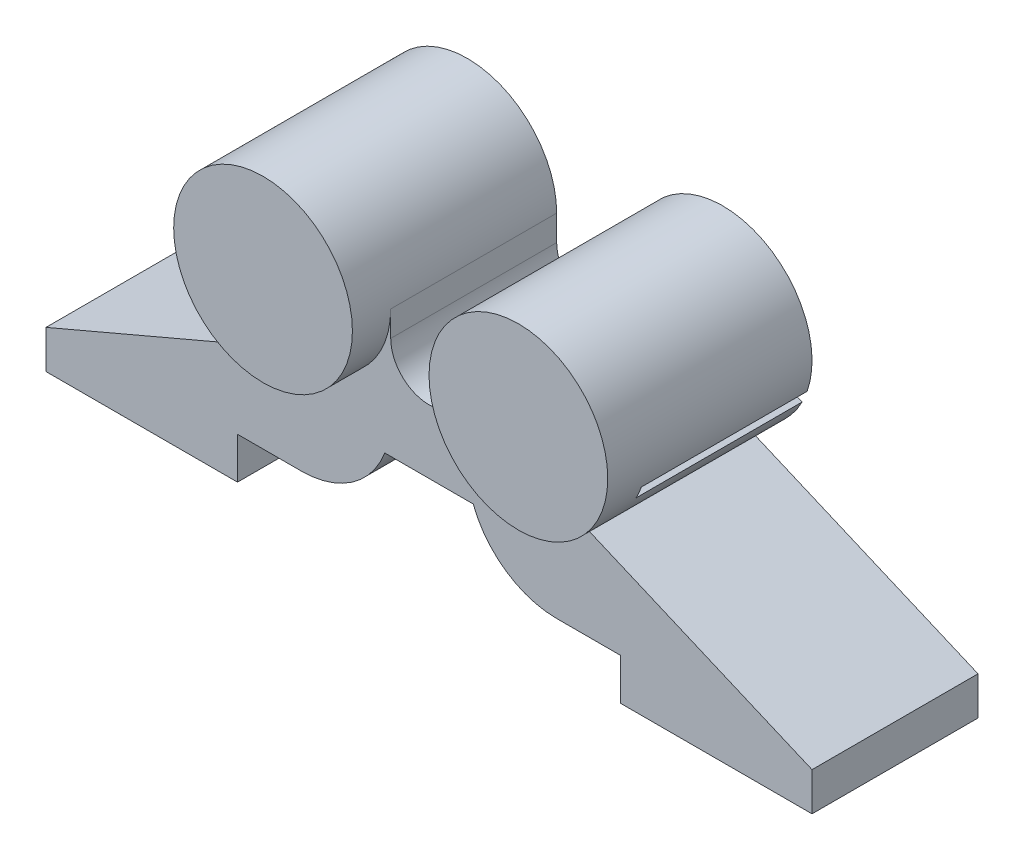
ISO-10303-21;
HEADER;
FILE_DESCRIPTION(('STEP AP214'),'2;1');
FILE_NAME('part.step','',(''),(''),'','','');
FILE_SCHEMA(('AUTOMOTIVE_DESIGN { 1 0 10303 214 1 1 1 1 }'));
ENDSEC;
DATA;
#1=APPLICATION_CONTEXT('core data for automotive mechanical design processes');
#2=APPLICATION_PROTOCOL_DEFINITION('international standard','automotive_design',2000,#1);
#3=PRODUCT_CONTEXT('',#1,'mechanical');
#4=PRODUCT('Part','Part','',(#3));
#5=PRODUCT_RELATED_PRODUCT_CATEGORY('part','',(#4));
#6=PRODUCT_DEFINITION_FORMATION('','',#4);
#7=PRODUCT_DEFINITION_CONTEXT('part definition',#1,'design');
#8=PRODUCT_DEFINITION('design','',#6,#7);
#9=PRODUCT_DEFINITION_SHAPE('','',#8);
#10=(LENGTH_UNIT() NAMED_UNIT(*) SI_UNIT(.MILLI.,.METRE.));
#11=(NAMED_UNIT(*) PLANE_ANGLE_UNIT() SI_UNIT($,.RADIAN.));
#12=(NAMED_UNIT(*) SI_UNIT($,.STERADIAN.) SOLID_ANGLE_UNIT());
#13=UNCERTAINTY_MEASURE_WITH_UNIT(LENGTH_MEASURE(1.E-05),#10,'distance_accuracy_value','');
#14=(GEOMETRIC_REPRESENTATION_CONTEXT(3) GLOBAL_UNCERTAINTY_ASSIGNED_CONTEXT((#13)) GLOBAL_UNIT_ASSIGNED_CONTEXT((#10,
#11,#12)) REPRESENTATION_CONTEXT('',''));
#15=CARTESIAN_POINT('',(0.,0.,0.));
#16=DIRECTION('',(0.,0.,1.));
#17=DIRECTION('',(1.,0.,0.));
#18=AXIS2_PLACEMENT_3D('',#15,#16,#17);
#19=CARTESIAN_POINT('',(10.,0.,13.));
#20=DIRECTION('',(0.,0.,-1.));
#21=DIRECTION('',(-1.,0.,0.));
#22=AXIS2_PLACEMENT_3D('',#19,#20,#21);
#23=CYLINDRICAL_SURFACE('',#22,7.);
#24=CARTESIAN_POINT('',(10.,0.,16.));
#25=DIRECTION('',(0.,0.,1.));
#26=DIRECTION('',(1.,0.,0.));
#27=AXIS2_PLACEMENT_3D('',#24,#25,#26);
#28=CIRCLE('',#27,7.);
#29=CARTESIAN_POINT('',(17.,0.,16.));
#30=VERTEX_POINT('',#29);
#31=EDGE_CURVE('E209',#30,#30,#28,.T.);
#32=ORIENTED_EDGE('',*,*,#31,.F.);
#33=EDGE_LOOP('',(#32));
#34=FACE_BOUND('',#33,.T.);
#35=DIRECTION('',(0.,0.,-1.));
#36=VECTOR('',#35,1.);
#37=CARTESIAN_POINT('',(16.2263129814132,-3.19891022966965,13.));
#38=LINE('',#37,#36);
#39=CARTESIAN_POINT('',(16.2263129814132,-3.19891022966965,13.));
#40=VERTEX_POINT('',#39);
#41=CARTESIAN_POINT('',(16.2263129814132,-3.19891022966965,0.));
#42=VERTEX_POINT('',#41);
#43=EDGE_CURVE('E204',#40,#42,#38,.T.);
#44=ORIENTED_EDGE('',*,*,#43,.F.);
#45=CARTESIAN_POINT('',(10.,0.,13.));
#46=DIRECTION('',(0.,0.,1.));
#47=DIRECTION('',(1.,0.,0.));
#48=AXIS2_PLACEMENT_3D('',#45,#46,#47);
#49=CIRCLE('',#48,7.);
#50=CARTESIAN_POINT('',(16.6185990767618,-2.27906697161088,13.));
#51=VERTEX_POINT('',#50);
#52=EDGE_CURVE('E11',#40,#51,#49,.T.);
#53=ORIENTED_EDGE('',*,*,#52,.T.);
#54=DIRECTION('',(0.,0.,-1.));
#55=VECTOR('',#54,1.);
#56=CARTESIAN_POINT('',(16.6185990767618,-2.27906697161088,13.));
#57=LINE('',#56,#55);
#58=CARTESIAN_POINT('',(16.6185990767618,-2.27906697161089,0.));
#59=VERTEX_POINT('',#58);
#60=EDGE_CURVE('E192',#59,#51,#57,.F.);
#61=ORIENTED_EDGE('',*,*,#60,.F.);
#62=CARTESIAN_POINT('',(10.,0.,0.));
#63=DIRECTION('',(0.,0.,1.));
#64=DIRECTION('',(1.,0.,0.));
#65=AXIS2_PLACEMENT_3D('',#62,#63,#64);
#66=CIRCLE('',#65,7.);
#67=CARTESIAN_POINT('',(3.,0.,0.));
#68=VERTEX_POINT('',#67);
#69=EDGE_CURVE('E149',#59,#68,#66,.T.);
#70=ORIENTED_EDGE('',*,*,#69,.T.);
#71=DIRECTION('',(0.,0.,-1.));
#72=VECTOR('',#71,1.);
#73=CARTESIAN_POINT('',(3.,0.,13.));
#74=LINE('',#73,#72);
#75=CARTESIAN_POINT('',(3.,0.,13.));
#76=VERTEX_POINT('',#75);
#77=EDGE_CURVE('E181',#76,#68,#74,.T.);
#78=ORIENTED_EDGE('',*,*,#77,.F.);
#79=CARTESIAN_POINT('',(10.,0.,13.));
#80=DIRECTION('',(0.,0.,1.));
#81=DIRECTION('',(1.,0.,0.));
#82=AXIS2_PLACEMENT_3D('',#79,#80,#81);
#83=CIRCLE('',#82,7.);
#84=CARTESIAN_POINT('',(11.4643974414723,-6.84511067356908,13.));
#85=VERTEX_POINT('',#84);
#86=EDGE_CURVE('E211',#76,#85,#83,.T.);
#87=ORIENTED_EDGE('',*,*,#86,.T.);
#88=DIRECTION('',(0.,0.,-1.));
#89=VECTOR('',#88,1.);
#90=CARTESIAN_POINT('',(11.4643974414723,-6.84511067356908,13.));
#91=LINE('',#90,#89);
#92=CARTESIAN_POINT('',(11.4643974414723,-6.84511067356908,0.));
#93=VERTEX_POINT('',#92);
#94=EDGE_CURVE('E141',#85,#93,#91,.T.);
#95=ORIENTED_EDGE('',*,*,#94,.T.);
#96=EDGE_CURVE('E145',#93,#42,#66,.T.);
#97=ORIENTED_EDGE('',*,*,#96,.T.);
#98=EDGE_LOOP('',(#44,#53,#61,#70,#78,#87,#95,#97));
#99=FACE_BOUND('',#98,.T.);
#100=ADVANCED_FACE('F34',(#34,#99),#23,.T.);
#101=CARTESIAN_POINT('',(0.,0.,0.));
#102=DIRECTION('',(0.,0.,1.));
#103=DIRECTION('',(1.,0.,0.));
#104=AXIS2_PLACEMENT_3D('',#101,#102,#103);
#105=PLANE('',#104);
#106=DIRECTION('',(0.919843258058762,-0.392286095348589,0.));
#107=VECTOR('',#106,1.);
#108=CARTESIAN_POINT('',(1.34274075836413,3.14849557133658,0.));
#109=LINE('',#108,#107);
#110=CARTESIAN_POINT('',(12.5247900036367,-1.62031954797082,0.));
#111=VERTEX_POINT('',#110);
#112=EDGE_CURVE('E448',#111,#42,#109,.T.);
#113=ORIENTED_EDGE('',*,*,#112,.T.);
#114=ORIENTED_EDGE('',*,*,#96,.F.);
#115=DIRECTION('',(-0.919843258058762,0.392286095348589,0.));
#116=VECTOR('',#115,1.);
#117=CARTESIAN_POINT('',(-0.705763952424521,-1.65489478499543,0.));
#118=LINE('',#117,#116);
#119=CARTESIAN_POINT('',(30.,-14.75,0.));
#120=VERTEX_POINT('',#119);
#121=EDGE_CURVE('E93',#120,#93,#118,.T.);
#122=ORIENTED_EDGE('',*,*,#121,.F.);
#123=DIRECTION('',(0.,1.,0.));
#124=VECTOR('',#123,1.);
#125=CARTESIAN_POINT('',(30.,0.,0.));
#126=LINE('',#125,#124);
#127=CARTESIAN_POINT('',(30.,-17.75,0.));
#128=VERTEX_POINT('',#127);
#129=EDGE_CURVE('E165',#128,#120,#126,.T.);
#130=ORIENTED_EDGE('',*,*,#129,.F.);
#131=DIRECTION('',(1.,0.,0.));
#132=VECTOR('',#131,1.);
#133=CARTESIAN_POINT('',(0.,-17.75,0.));
#134=LINE('',#133,#132);
#135=CARTESIAN_POINT('',(15.,-17.75,0.));
#136=VERTEX_POINT('',#135);
#137=EDGE_CURVE('E133',#136,#128,#134,.T.);
#138=ORIENTED_EDGE('',*,*,#137,.F.);
#139=DIRECTION('',(0.,-1.,0.));
#140=VECTOR('',#139,1.);
#141=CARTESIAN_POINT('',(15.,0.,0.));
#142=LINE('',#141,#140);
#143=CARTESIAN_POINT('',(15.,-14.5,0.));
#144=VERTEX_POINT('',#143);
#145=EDGE_CURVE('E162',#144,#136,#142,.T.);
#146=ORIENTED_EDGE('',*,*,#145,.F.);
#147=DIRECTION('',(1.,0.,0.));
#148=VECTOR('',#147,1.);
#149=CARTESIAN_POINT('',(0.,-14.5,0.));
#150=LINE('',#149,#148);
#151=CARTESIAN_POINT('',(10.,-14.5,0.));
#152=VERTEX_POINT('',#151);
#153=EDGE_CURVE('E160',#152,#144,#150,.T.);
#154=ORIENTED_EDGE('',*,*,#153,.F.);
#155=CARTESIAN_POINT('',(10.,-7.5,0.));
#156=DIRECTION('',(0.,0.,1.));
#157=DIRECTION('',(1.,0.,0.));
#158=AXIS2_PLACEMENT_3D('',#155,#156,#157);
#159=CIRCLE('',#158,7.);
#160=CARTESIAN_POINT('',(3.46165158468899,-10.,0.));
#161=VERTEX_POINT('',#160);
#162=EDGE_CURVE('E158',#161,#152,#159,.T.);
#163=ORIENTED_EDGE('',*,*,#162,.F.);
#164=DIRECTION('',(-1.,0.,0.));
#165=VECTOR('',#164,1.);
#166=CARTESIAN_POINT('',(0.,-10.,0.));
#167=LINE('',#166,#165);
#168=CARTESIAN_POINT('',(-3.46165158468899,-10.,0.));
#169=VERTEX_POINT('',#168);
#170=EDGE_CURVE('E155',#161,#169,#167,.T.);
#171=ORIENTED_EDGE('',*,*,#170,.T.);
#172=CARTESIAN_POINT('',(-10.,-7.5,0.));
#173=DIRECTION('',(0.,0.,-1.));
#174=DIRECTION('',(-1.,0.,0.));
#175=AXIS2_PLACEMENT_3D('',#172,#173,#174);
#176=CIRCLE('',#175,7.);
#177=CARTESIAN_POINT('',(-10.,-14.5,0.));
#178=VERTEX_POINT('',#177);
#179=EDGE_CURVE('E403',#169,#178,#176,.T.);
#180=ORIENTED_EDGE('',*,*,#179,.T.);
#181=DIRECTION('',(-1.,0.,0.));
#182=VECTOR('',#181,1.);
#183=CARTESIAN_POINT('',(0.,-14.5,0.));
#184=LINE('',#183,#182);
#185=CARTESIAN_POINT('',(-15.,-14.5,0.));
#186=VERTEX_POINT('',#185);
#187=EDGE_CURVE('E406',#178,#186,#184,.T.);
#188=ORIENTED_EDGE('',*,*,#187,.T.);
#189=DIRECTION('',(0.,-1.,0.));
#190=VECTOR('',#189,1.);
#191=CARTESIAN_POINT('',(-15.,0.,0.));
#192=LINE('',#191,#190);
#193=CARTESIAN_POINT('',(-15.,-17.75,0.));
#194=VERTEX_POINT('',#193);
#195=EDGE_CURVE('E409',#186,#194,#192,.T.);
#196=ORIENTED_EDGE('',*,*,#195,.T.);
#197=DIRECTION('',(-1.,0.,0.));
#198=VECTOR('',#197,1.);
#199=CARTESIAN_POINT('',(0.,-17.75,0.));
#200=LINE('',#199,#198);
#201=CARTESIAN_POINT('',(-30.,-17.75,0.));
#202=VERTEX_POINT('',#201);
#203=EDGE_CURVE('E412',#194,#202,#200,.T.);
#204=ORIENTED_EDGE('',*,*,#203,.T.);
#205=DIRECTION('',(0.,1.,0.));
#206=VECTOR('',#205,1.);
#207=CARTESIAN_POINT('',(-30.,0.,0.));
#208=LINE('',#207,#206);
#209=CARTESIAN_POINT('',(-30.,-14.75,0.));
#210=VERTEX_POINT('',#209);
#211=EDGE_CURVE('E415',#202,#210,#208,.T.);
#212=ORIENTED_EDGE('',*,*,#211,.T.);
#213=DIRECTION('',(0.919843258058762,0.392286095348589,0.));
#214=VECTOR('',#213,1.);
#215=CARTESIAN_POINT('',(0.705763952424521,-1.65489478499543,0.));
#216=LINE('',#215,#214);
#217=CARTESIAN_POINT('',(-11.4643974414723,-6.84511067356908,0.));
#218=VERTEX_POINT('',#217);
#219=EDGE_CURVE('E379',#210,#218,#216,.T.);
#220=ORIENTED_EDGE('',*,*,#219,.T.);
#221=CARTESIAN_POINT('',(-10.,0.,0.));
#222=DIRECTION('',(0.,0.,-1.));
#223=DIRECTION('',(-1.,0.,0.));
#224=AXIS2_PLACEMENT_3D('',#221,#222,#223);
#225=CIRCLE('',#224,7.);
#226=CARTESIAN_POINT('',(-16.2263129814132,-3.19891022966965,0.));
#227=VERTEX_POINT('',#226);
#228=EDGE_CURVE('E397',#218,#227,#225,.T.);
#229=ORIENTED_EDGE('',*,*,#228,.T.);
#230=DIRECTION('',(-0.919843258058762,-0.392286095348589,0.));
#231=VECTOR('',#230,1.);
#232=CARTESIAN_POINT('',(-1.34274075836413,3.14849557133658,0.));
#233=LINE('',#232,#231);
#234=CARTESIAN_POINT('',(-12.5247900036367,-1.62031954797082,0.));
#235=VERTEX_POINT('',#234);
#236=EDGE_CURVE('E353',#235,#227,#233,.T.);
#237=ORIENTED_EDGE('',*,*,#236,.F.);
#238=CARTESIAN_POINT('',(-10.,0.,0.));
#239=DIRECTION('',(0.,0.,-1.));
#240=DIRECTION('',(-1.,0.,0.));
#241=AXIS2_PLACEMENT_3D('',#238,#239,#240);
#242=CIRCLE('',#241,3.);
#243=CARTESIAN_POINT('',(-12.9170760989853,-0.700476289912056,0.));
#244=VERTEX_POINT('',#243);
#245=EDGE_CURVE('E340',#244,#235,#242,.T.);
#246=ORIENTED_EDGE('',*,*,#245,.F.);
#247=DIRECTION('',(-0.919843258058762,-0.392286095348589,0.));
#248=VECTOR('',#247,1.);
#249=CARTESIAN_POINT('',(-1.73502685371272,4.06833882939535,0.));
#250=LINE('',#249,#248);
#251=CARTESIAN_POINT('',(-16.6185990767618,-2.27906697161089,0.));
#252=VERTEX_POINT('',#251);
#253=EDGE_CURVE('E440',#244,#252,#250,.T.);
#254=ORIENTED_EDGE('',*,*,#253,.T.);
#255=CARTESIAN_POINT('',(-3.,0.,0.));
#256=VERTEX_POINT('',#255);
#257=EDGE_CURVE('E372',#252,#256,#225,.T.);
#258=ORIENTED_EDGE('',*,*,#257,.T.);
#259=DIRECTION('',(0.,-1.,0.));
#260=VECTOR('',#259,1.);
#261=CARTESIAN_POINT('',(-3.,0.,0.));
#262=LINE('',#261,#260);
#263=CARTESIAN_POINT('',(-3.,-2.,0.));
#264=VERTEX_POINT('',#263);
#265=EDGE_CURVE('E400',#256,#264,#262,.T.);
#266=ORIENTED_EDGE('',*,*,#265,.T.);
#267=CARTESIAN_POINT('',(0.,-2.,0.));
#268=DIRECTION('',(0.,0.,1.));
#269=DIRECTION('',(1.,0.,0.));
#270=AXIS2_PLACEMENT_3D('',#267,#268,#269);
#271=CIRCLE('',#270,3.);
#272=CARTESIAN_POINT('',(3.,-2.,0.));
#273=VERTEX_POINT('',#272);
#274=EDGE_CURVE('E152',#264,#273,#271,.T.);
#275=ORIENTED_EDGE('',*,*,#274,.T.);
#276=DIRECTION('',(0.,-1.,0.));
#277=VECTOR('',#276,1.);
#278=CARTESIAN_POINT('',(3.,0.,0.));
#279=LINE('',#278,#277);
#280=EDGE_CURVE('E148',#68,#273,#279,.T.);
#281=ORIENTED_EDGE('',*,*,#280,.F.);
#282=ORIENTED_EDGE('',*,*,#69,.F.);
#283=DIRECTION('',(0.919843258058762,-0.392286095348589,0.));
#284=VECTOR('',#283,1.);
#285=CARTESIAN_POINT('',(1.73502685371272,4.06833882939535,0.));
#286=LINE('',#285,#284);
#287=CARTESIAN_POINT('',(12.9170760989853,-0.700476289912056,0.));
#288=VERTEX_POINT('',#287);
#289=EDGE_CURVE('E41',#288,#59,#286,.T.);
#290=ORIENTED_EDGE('',*,*,#289,.F.);
#291=CARTESIAN_POINT('',(10.,0.,0.));
#292=DIRECTION('',(0.,0.,1.));
#293=DIRECTION('',(1.,0.,0.));
#294=AXIS2_PLACEMENT_3D('',#291,#292,#293);
#295=CIRCLE('',#294,3.);
#296=EDGE_CURVE('E48',#288,#111,#295,.T.);
#297=ORIENTED_EDGE('',*,*,#296,.T.);
#298=EDGE_LOOP('',(#113,#114,#122,#130,#138,#146,#154,#163,#171,#180,#188,#196,#204,#212,#220,
#229,#237,#246,#254,#258,#266,#275,#281,#282,#290,#297));
#299=FACE_BOUND('',#298,.T.);
#300=ADVANCED_FACE('F208',(#299),#105,.F.);
#301=CARTESIAN_POINT('',(3.,0.,13.));
#302=DIRECTION('',(1.,0.,0.));
#303=DIRECTION('',(0.,1.,0.));
#304=AXIS2_PLACEMENT_3D('',#301,#302,#303);
#305=PLANE('',#304);
#306=ORIENTED_EDGE('',*,*,#280,.T.);
#307=DIRECTION('',(0.,0.,-1.));
#308=VECTOR('',#307,1.);
#309=CARTESIAN_POINT('',(3.,-2.,13.));
#310=LINE('',#309,#308);
#311=CARTESIAN_POINT('',(3.,-2.,13.));
#312=VERTEX_POINT('',#311);
#313=EDGE_CURVE('E179',#312,#273,#310,.T.);
#314=ORIENTED_EDGE('',*,*,#313,.F.);
#315=DIRECTION('',(0.,-1.,0.));
#316=VECTOR('',#315,1.);
#317=CARTESIAN_POINT('',(3.,0.,13.));
#318=LINE('',#317,#316);
#319=EDGE_CURVE('E100',#76,#312,#318,.T.);
#320=ORIENTED_EDGE('',*,*,#319,.F.);
#321=ORIENTED_EDGE('',*,*,#77,.T.);
#322=EDGE_LOOP('',(#306,#314,#320,#321));
#323=FACE_BOUND('',#322,.T.);
#324=ADVANCED_FACE('F477',(#323),#305,.F.);
#325=CARTESIAN_POINT('',(0.,-2.,13.));
#326=DIRECTION('',(0.,0.,-1.));
#327=DIRECTION('',(-1.,0.,0.));
#328=AXIS2_PLACEMENT_3D('',#325,#326,#327);
#329=CYLINDRICAL_SURFACE('',#328,3.);
#330=ORIENTED_EDGE('',*,*,#274,.F.);
#331=DIRECTION('',(0.,0.,-1.));
#332=VECTOR('',#331,1.);
#333=CARTESIAN_POINT('',(-3.,-2.,13.));
#334=LINE('',#333,#332);
#335=CARTESIAN_POINT('',(-3.,-2.,13.));
#336=VERTEX_POINT('',#335);
#337=EDGE_CURVE('E434',#336,#264,#334,.T.);
#338=ORIENTED_EDGE('',*,*,#337,.F.);
#339=CARTESIAN_POINT('',(0.,-2.,13.));
#340=DIRECTION('',(0.,0.,1.));
#341=DIRECTION('',(1.,0.,0.));
#342=AXIS2_PLACEMENT_3D('',#339,#340,#341);
#343=CIRCLE('',#342,3.);
#344=EDGE_CURVE('E220',#336,#312,#343,.T.);
#345=ORIENTED_EDGE('',*,*,#344,.T.);
#346=ORIENTED_EDGE('',*,*,#313,.T.);
#347=EDGE_LOOP('',(#330,#338,#345,#346));
#348=FACE_BOUND('',#347,.T.);
#349=ADVANCED_FACE('F482',(#348),#329,.F.);
#350=CARTESIAN_POINT('',(0.,-10.,13.));
#351=DIRECTION('',(0.,-1.,0.));
#352=DIRECTION('',(0.,0.,-1.));
#353=AXIS2_PLACEMENT_3D('',#350,#351,#352);
#354=PLANE('',#353);
#355=ORIENTED_EDGE('',*,*,#170,.F.);
#356=DIRECTION('',(0.,0.,-1.));
#357=VECTOR('',#356,1.);
#358=CARTESIAN_POINT('',(3.46165158468899,-10.,13.));
#359=LINE('',#358,#357);
#360=CARTESIAN_POINT('',(3.46165158468899,-10.,13.));
#361=VERTEX_POINT('',#360);
#362=EDGE_CURVE('E177',#361,#161,#359,.T.);
#363=ORIENTED_EDGE('',*,*,#362,.F.);
#364=DIRECTION('',(-1.,0.,0.));
#365=VECTOR('',#364,1.);
#366=CARTESIAN_POINT('',(0.,-10.,13.));
#367=LINE('',#366,#365);
#368=CARTESIAN_POINT('',(-3.46165158468899,-10.,13.));
#369=VERTEX_POINT('',#368);
#370=EDGE_CURVE('E223',#361,#369,#367,.T.);
#371=ORIENTED_EDGE('',*,*,#370,.T.);
#372=DIRECTION('',(0.,0.,-1.));
#373=VECTOR('',#372,1.);
#374=CARTESIAN_POINT('',(-3.46165158468899,-10.,13.));
#375=LINE('',#374,#373);
#376=EDGE_CURVE('E431',#369,#169,#375,.T.);
#377=ORIENTED_EDGE('',*,*,#376,.T.);
#378=EDGE_LOOP('',(#355,#363,#371,#377));
#379=FACE_BOUND('',#378,.T.);
#380=ADVANCED_FACE('F499',(#379),#354,.T.);
#381=CARTESIAN_POINT('',(10.,-7.5,13.));
#382=DIRECTION('',(0.,0.,-1.));
#383=DIRECTION('',(-1.,0.,0.));
#384=AXIS2_PLACEMENT_3D('',#381,#382,#383);
#385=CYLINDRICAL_SURFACE('',#384,7.);
#386=ORIENTED_EDGE('',*,*,#162,.T.);
#387=DIRECTION('',(0.,0.,-1.));
#388=VECTOR('',#387,1.);
#389=CARTESIAN_POINT('',(10.,-14.5,13.));
#390=LINE('',#389,#388);
#391=CARTESIAN_POINT('',(10.,-14.5,13.));
#392=VERTEX_POINT('',#391);
#393=EDGE_CURVE('E174',#392,#152,#390,.T.);
#394=ORIENTED_EDGE('',*,*,#393,.F.);
#395=CARTESIAN_POINT('',(10.,-7.5,13.));
#396=DIRECTION('',(0.,0.,1.));
#397=DIRECTION('',(1.,0.,0.));
#398=AXIS2_PLACEMENT_3D('',#395,#396,#397);
#399=CIRCLE('',#398,7.);
#400=EDGE_CURVE('E226',#361,#392,#399,.T.);
#401=ORIENTED_EDGE('',*,*,#400,.F.);
#402=ORIENTED_EDGE('',*,*,#362,.T.);
#403=EDGE_LOOP('',(#386,#394,#401,#402));
#404=FACE_BOUND('',#403,.T.);
#405=ADVANCED_FACE('F496',(#404),#385,.T.);
#406=CARTESIAN_POINT('',(0.,-14.5,13.));
#407=DIRECTION('',(0.,1.,0.));
#408=DIRECTION('',(0.,0.,1.));
#409=AXIS2_PLACEMENT_3D('',#406,#407,#408);
#410=PLANE('',#409);
#411=ORIENTED_EDGE('',*,*,#153,.T.);
#412=DIRECTION('',(0.,0.,-1.));
#413=VECTOR('',#412,1.);
#414=CARTESIAN_POINT('',(15.,-14.5,13.));
#415=LINE('',#414,#413);
#416=CARTESIAN_POINT('',(15.,-14.5,13.));
#417=VERTEX_POINT('',#416);
#418=EDGE_CURVE('E171',#417,#144,#415,.T.);
#419=ORIENTED_EDGE('',*,*,#418,.F.);
#420=DIRECTION('',(1.,0.,0.));
#421=VECTOR('',#420,1.);
#422=CARTESIAN_POINT('',(0.,-14.5,13.));
#423=LINE('',#422,#421);
#424=EDGE_CURVE('E228',#392,#417,#423,.T.);
#425=ORIENTED_EDGE('',*,*,#424,.F.);
#426=ORIENTED_EDGE('',*,*,#393,.T.);
#427=EDGE_LOOP('',(#411,#419,#425,#426));
#428=FACE_BOUND('',#427,.T.);
#429=ADVANCED_FACE('F235',(#428),#410,.F.);
#430=CARTESIAN_POINT('',(15.,0.,13.));
#431=DIRECTION('',(1.,0.,0.));
#432=DIRECTION('',(0.,0.,-1.));
#433=AXIS2_PLACEMENT_3D('',#430,#431,#432);
#434=PLANE('',#433);
#435=ORIENTED_EDGE('',*,*,#145,.T.);
#436=DIRECTION('',(0.,0.,-1.));
#437=VECTOR('',#436,1.);
#438=CARTESIAN_POINT('',(15.,-17.75,13.));
#439=LINE('',#438,#437);
#440=CARTESIAN_POINT('',(15.,-17.75,13.));
#441=VERTEX_POINT('',#440);
#442=EDGE_CURVE('E136',#441,#136,#439,.T.);
#443=ORIENTED_EDGE('',*,*,#442,.F.);
#444=DIRECTION('',(0.,-1.,0.));
#445=VECTOR('',#444,1.);
#446=CARTESIAN_POINT('',(15.,0.,13.));
#447=LINE('',#446,#445);
#448=EDGE_CURVE('E124',#417,#441,#447,.T.);
#449=ORIENTED_EDGE('',*,*,#448,.F.);
#450=ORIENTED_EDGE('',*,*,#418,.T.);
#451=EDGE_LOOP('',(#435,#443,#449,#450));
#452=FACE_BOUND('',#451,.T.);
#453=ADVANCED_FACE('F239',(#452),#434,.F.);
#454=CARTESIAN_POINT('',(0.,-17.75,13.));
#455=DIRECTION('',(0.,1.,0.));
#456=DIRECTION('',(-1.,0.,0.));
#457=AXIS2_PLACEMENT_3D('',#454,#455,#456);
#458=PLANE('',#457);
#459=ORIENTED_EDGE('',*,*,#137,.T.);
#460=DIRECTION('',(0.,0.,-1.));
#461=VECTOR('',#460,1.);
#462=CARTESIAN_POINT('',(30.,-17.75,13.));
#463=LINE('',#462,#461);
#464=CARTESIAN_POINT('',(30.,-17.75,13.));
#465=VERTEX_POINT('',#464);
#466=EDGE_CURVE('E130',#465,#128,#463,.T.);
#467=ORIENTED_EDGE('',*,*,#466,.F.);
#468=DIRECTION('',(1.,0.,0.));
#469=VECTOR('',#468,1.);
#470=CARTESIAN_POINT('',(0.,-17.75,13.));
#471=LINE('',#470,#469);
#472=EDGE_CURVE('E117',#441,#465,#471,.T.);
#473=ORIENTED_EDGE('',*,*,#472,.F.);
#474=ORIENTED_EDGE('',*,*,#442,.T.);
#475=EDGE_LOOP('',(#459,#467,#473,#474));
#476=FACE_BOUND('',#475,.T.);
#477=ADVANCED_FACE('F131',(#476),#458,.F.);
#478=CARTESIAN_POINT('',(30.,0.,13.));
#479=DIRECTION('',(-1.,0.,0.));
#480=DIRECTION('',(0.,0.,1.));
#481=AXIS2_PLACEMENT_3D('',#478,#479,#480);
#482=PLANE('',#481);
#483=ORIENTED_EDGE('',*,*,#129,.T.);
#484=DIRECTION('',(0.,0.,-1.));
#485=VECTOR('',#484,1.);
#486=CARTESIAN_POINT('',(30.,-14.75,13.));
#487=LINE('',#486,#485);
#488=CARTESIAN_POINT('',(30.,-14.75,13.));
#489=VERTEX_POINT('',#488);
#490=EDGE_CURVE('E137',#489,#120,#487,.T.);
#491=ORIENTED_EDGE('',*,*,#490,.F.);
#492=DIRECTION('',(0.,1.,0.));
#493=VECTOR('',#492,1.);
#494=CARTESIAN_POINT('',(30.,0.,13.));
#495=LINE('',#494,#493);
#496=EDGE_CURVE('E121',#465,#489,#495,.T.);
#497=ORIENTED_EDGE('',*,*,#496,.F.);
#498=ORIENTED_EDGE('',*,*,#466,.T.);
#499=EDGE_LOOP('',(#483,#491,#497,#498));
#500=FACE_BOUND('',#499,.T.);
#501=ADVANCED_FACE('F139',(#500),#482,.F.);
#502=CARTESIAN_POINT('',(-0.705763952424521,-1.65489478499543,13.));
#503=DIRECTION('',(-0.392286095348589,-0.919843258058762,0.));
#504=DIRECTION('',(0.919843258058762,-0.392286095348589,0.));
#505=AXIS2_PLACEMENT_3D('',#502,#503,#504);
#506=PLANE('',#505);
#507=ORIENTED_EDGE('',*,*,#121,.T.);
#508=ORIENTED_EDGE('',*,*,#94,.F.);
#509=DIRECTION('',(-0.919843258058762,0.392286095348589,0.));
#510=VECTOR('',#509,1.);
#511=CARTESIAN_POINT('',(-0.705763952424521,-1.65489478499543,13.));
#512=LINE('',#511,#510);
#513=EDGE_CURVE('E57',#489,#85,#512,.T.);
#514=ORIENTED_EDGE('',*,*,#513,.F.);
#515=ORIENTED_EDGE('',*,*,#490,.T.);
#516=EDGE_LOOP('',(#507,#508,#514,#515));
#517=FACE_BOUND('',#516,.T.);
#518=ADVANCED_FACE('F241',(#517),#506,.F.);
#519=CARTESIAN_POINT('',(0.,0.,13.));
#520=DIRECTION('',(0.,0.,1.));
#521=DIRECTION('',(1.,0.,0.));
#522=AXIS2_PLACEMENT_3D('',#519,#520,#521);
#523=PLANE('',#522);
#524=ORIENTED_EDGE('',*,*,#86,.F.);
#525=ORIENTED_EDGE('',*,*,#319,.T.);
#526=ORIENTED_EDGE('',*,*,#344,.F.);
#527=DIRECTION('',(0.,-1.,0.));
#528=VECTOR('',#527,1.);
#529=CARTESIAN_POINT('',(-3.,0.,13.));
#530=LINE('',#529,#528);
#531=CARTESIAN_POINT('',(-3.,0.,13.));
#532=VERTEX_POINT('',#531);
#533=EDGE_CURVE('E375',#532,#336,#530,.T.);
#534=ORIENTED_EDGE('',*,*,#533,.F.);
#535=CARTESIAN_POINT('',(-10.,0.,13.));
#536=DIRECTION('',(0.,0.,-1.));
#537=DIRECTION('',(-1.,0.,0.));
#538=AXIS2_PLACEMENT_3D('',#535,#536,#537);
#539=CIRCLE('',#538,7.);
#540=CARTESIAN_POINT('',(-11.4643974414723,-6.84511067356908,13.));
#541=VERTEX_POINT('',#540);
#542=EDGE_CURVE('E368',#532,#541,#539,.T.);
#543=ORIENTED_EDGE('',*,*,#542,.T.);
#544=DIRECTION('',(0.919843258058762,0.392286095348589,0.));
#545=VECTOR('',#544,1.);
#546=CARTESIAN_POINT('',(0.705763952424521,-1.65489478499543,13.));
#547=LINE('',#546,#545);
#548=CARTESIAN_POINT('',(-30.,-14.75,13.));
#549=VERTEX_POINT('',#548);
#550=EDGE_CURVE('E394',#549,#541,#547,.T.);
#551=ORIENTED_EDGE('',*,*,#550,.F.);
#552=DIRECTION('',(0.,1.,0.));
#553=VECTOR('',#552,1.);
#554=CARTESIAN_POINT('',(-30.,0.,13.));
#555=LINE('',#554,#553);
#556=CARTESIAN_POINT('',(-30.,-17.75,13.));
#557=VERTEX_POINT('',#556);
#558=EDGE_CURVE('E391',#557,#549,#555,.T.);
#559=ORIENTED_EDGE('',*,*,#558,.F.);
#560=DIRECTION('',(-1.,0.,0.));
#561=VECTOR('',#560,1.);
#562=CARTESIAN_POINT('',(0.,-17.75,13.));
#563=LINE('',#562,#561);
#564=CARTESIAN_POINT('',(-15.,-17.75,13.));
#565=VERTEX_POINT('',#564);
#566=EDGE_CURVE('E388',#565,#557,#563,.T.);
#567=ORIENTED_EDGE('',*,*,#566,.F.);
#568=DIRECTION('',(0.,-1.,0.));
#569=VECTOR('',#568,1.);
#570=CARTESIAN_POINT('',(-15.,0.,13.));
#571=LINE('',#570,#569);
#572=CARTESIAN_POINT('',(-15.,-14.5,13.));
#573=VERTEX_POINT('',#572);
#574=EDGE_CURVE('E385',#573,#565,#571,.T.);
#575=ORIENTED_EDGE('',*,*,#574,.F.);
#576=DIRECTION('',(-1.,0.,0.));
#577=VECTOR('',#576,1.);
#578=CARTESIAN_POINT('',(0.,-14.5,13.));
#579=LINE('',#578,#577);
#580=CARTESIAN_POINT('',(-10.,-14.5,13.));
#581=VERTEX_POINT('',#580);
#582=EDGE_CURVE('E382',#581,#573,#579,.T.);
#583=ORIENTED_EDGE('',*,*,#582,.F.);
#584=CARTESIAN_POINT('',(-10.,-7.5,13.));
#585=DIRECTION('',(0.,0.,-1.));
#586=DIRECTION('',(-1.,0.,0.));
#587=AXIS2_PLACEMENT_3D('',#584,#585,#586);
#588=CIRCLE('',#587,7.);
#589=EDGE_CURVE('E378',#369,#581,#588,.T.);
#590=ORIENTED_EDGE('',*,*,#589,.F.);
#591=ORIENTED_EDGE('',*,*,#370,.F.);
#592=ORIENTED_EDGE('',*,*,#400,.T.);
#593=ORIENTED_EDGE('',*,*,#424,.T.);
#594=ORIENTED_EDGE('',*,*,#448,.T.);
#595=ORIENTED_EDGE('',*,*,#472,.T.);
#596=ORIENTED_EDGE('',*,*,#496,.T.);
#597=ORIENTED_EDGE('',*,*,#513,.T.);
#598=EDGE_LOOP('',(#524,#525,#526,#534,#543,#551,#559,#567,#575,#583,#590,#591,#592,#593,#594,
#595,#596,#597));
#599=FACE_BOUND('',#598,.T.);
#600=ADVANCED_FACE('F119',(#599),#523,.T.);
#601=CARTESIAN_POINT('',(10.,0.,16.));
#602=DIRECTION('',(0.,0.,1.));
#603=DIRECTION('',(1.,0.,0.));
#604=AXIS2_PLACEMENT_3D('',#601,#602,#603);
#605=PLANE('',#604);
#606=ORIENTED_EDGE('',*,*,#31,.T.);
#607=EDGE_LOOP('',(#606));
#608=FACE_BOUND('',#607,.T.);
#609=ADVANCED_FACE('F462',(#608),#605,.T.);
#610=CARTESIAN_POINT('',(0.,0.,13.));
#611=DIRECTION('',(0.,0.,1.));
#612=DIRECTION('',(1.,0.,0.));
#613=AXIS2_PLACEMENT_3D('',#610,#611,#612);
#614=PLANE('',#613);
#615=DIRECTION('',(0.919843258058762,-0.392286095348589,0.));
#616=VECTOR('',#615,1.);
#617=CARTESIAN_POINT('',(1.34274075836413,3.14849557133658,13.));
#618=LINE('',#617,#616);
#619=CARTESIAN_POINT('',(12.5247900036367,-1.62031954797082,13.));
#620=VERTEX_POINT('',#619);
#621=EDGE_CURVE('E447',#620,#40,#618,.T.);
#622=ORIENTED_EDGE('',*,*,#621,.F.);
#623=CARTESIAN_POINT('',(10.,0.,13.));
#624=DIRECTION('',(0.,0.,1.));
#625=DIRECTION('',(1.,0.,0.));
#626=AXIS2_PLACEMENT_3D('',#623,#624,#625);
#627=CIRCLE('',#626,3.);
#628=CARTESIAN_POINT('',(12.9170760989853,-0.700476289912056,13.));
#629=VERTEX_POINT('',#628);
#630=EDGE_CURVE('E444',#629,#620,#627,.T.);
#631=ORIENTED_EDGE('',*,*,#630,.F.);
#632=DIRECTION('',(-0.919843258058762,0.392286095348589,0.));
#633=VECTOR('',#632,1.);
#634=CARTESIAN_POINT('',(1.73502685371272,4.06833882939535,13.));
#635=LINE('',#634,#633);
#636=EDGE_CURVE('E450',#51,#629,#635,.T.);
#637=ORIENTED_EDGE('',*,*,#636,.F.);
#638=ORIENTED_EDGE('',*,*,#52,.F.);
#639=EDGE_LOOP('',(#622,#631,#637,#638));
#640=FACE_BOUND('',#639,.T.);
#641=ADVANCED_FACE('F460',(#640),#614,.F.);
#642=CARTESIAN_POINT('',(1.34274075836413,3.14849557133658,13.));
#643=DIRECTION('',(0.392286095348589,0.919843258058762,0.));
#644=DIRECTION('',(-0.919843258058762,0.392286095348589,0.));
#645=AXIS2_PLACEMENT_3D('',#642,#643,#644);
#646=PLANE('',#645);
#647=ORIENTED_EDGE('',*,*,#43,.T.);
#648=ORIENTED_EDGE('',*,*,#112,.F.);
#649=DIRECTION('',(0.,0.,-1.));
#650=VECTOR('',#649,1.);
#651=CARTESIAN_POINT('',(12.5247900036367,-1.62031954797082,13.));
#652=LINE('',#651,#650);
#653=EDGE_CURVE('E205',#620,#111,#652,.T.);
#654=ORIENTED_EDGE('',*,*,#653,.F.);
#655=ORIENTED_EDGE('',*,*,#621,.T.);
#656=EDGE_LOOP('',(#647,#648,#654,#655));
#657=FACE_BOUND('',#656,.T.);
#658=ADVANCED_FACE('F459',(#657),#646,.T.);
#659=CARTESIAN_POINT('',(1.73502685371272,4.06833882939535,13.));
#660=DIRECTION('',(-0.392286095348589,-0.919843258058762,0.));
#661=DIRECTION('',(0.919843258058762,-0.392286095348589,0.));
#662=AXIS2_PLACEMENT_3D('',#659,#660,#661);
#663=PLANE('',#662);
#664=ORIENTED_EDGE('',*,*,#60,.T.);
#665=ORIENTED_EDGE('',*,*,#636,.T.);
#666=DIRECTION('',(0.,0.,-1.));
#667=VECTOR('',#666,1.);
#668=CARTESIAN_POINT('',(12.9170760989853,-0.700476289912056,13.));
#669=LINE('',#668,#667);
#670=EDGE_CURVE('E194',#629,#288,#669,.T.);
#671=ORIENTED_EDGE('',*,*,#670,.T.);
#672=ORIENTED_EDGE('',*,*,#289,.T.);
#673=EDGE_LOOP('',(#664,#665,#671,#672));
#674=FACE_BOUND('',#673,.T.);
#675=ADVANCED_FACE('F189',(#674),#663,.T.);
#676=CARTESIAN_POINT('',(10.,0.,13.));
#677=DIRECTION('',(0.,0.,-1.));
#678=DIRECTION('',(-1.,0.,0.));
#679=AXIS2_PLACEMENT_3D('',#676,#677,#678);
#680=CYLINDRICAL_SURFACE('',#679,3.);
#681=ORIENTED_EDGE('',*,*,#296,.F.);
#682=ORIENTED_EDGE('',*,*,#670,.F.);
#683=ORIENTED_EDGE('',*,*,#630,.T.);
#684=ORIENTED_EDGE('',*,*,#653,.T.);
#685=EDGE_LOOP('',(#681,#682,#683,#684));
#686=FACE_BOUND('',#685,.T.);
#687=ADVANCED_FACE('F456',(#686),#680,.F.);
#688=CARTESIAN_POINT('',(-10.,0.,13.));
#689=DIRECTION('',(0.,0.,-1.));
#690=DIRECTION('',(1.,0.,0.));
#691=AXIS2_PLACEMENT_3D('',#688,#689,#690);
#692=CYLINDRICAL_SURFACE('',#691,7.);
#693=CARTESIAN_POINT('',(-10.,0.,16.));
#694=DIRECTION('',(0.,0.,-1.));
#695=DIRECTION('',(-1.,0.,0.));
#696=AXIS2_PLACEMENT_3D('',#693,#694,#695);
#697=CIRCLE('',#696,7.);
#698=CARTESIAN_POINT('',(-17.,0.,16.));
#699=VERTEX_POINT('',#698);
#700=EDGE_CURVE('E369',#699,#699,#697,.T.);
#701=ORIENTED_EDGE('',*,*,#700,.T.);
#702=EDGE_LOOP('',(#701));
#703=FACE_BOUND('',#702,.T.);
#704=DIRECTION('',(0.,0.,-1.));
#705=VECTOR('',#704,1.);
#706=CARTESIAN_POINT('',(-16.2263129814132,-3.19891022966965,13.));
#707=LINE('',#706,#705);
#708=CARTESIAN_POINT('',(-16.2263129814132,-3.19891022966965,13.));
#709=VERTEX_POINT('',#708);
#710=EDGE_CURVE('E358',#709,#227,#707,.T.);
#711=ORIENTED_EDGE('',*,*,#710,.T.);
#712=ORIENTED_EDGE('',*,*,#228,.F.);
#713=DIRECTION('',(0.,0.,-1.));
#714=VECTOR('',#713,1.);
#715=CARTESIAN_POINT('',(-11.4643974414723,-6.84511067356908,13.));
#716=LINE('',#715,#714);
#717=EDGE_CURVE('E396',#541,#218,#716,.T.);
#718=ORIENTED_EDGE('',*,*,#717,.F.);
#719=ORIENTED_EDGE('',*,*,#542,.F.);
#720=DIRECTION('',(0.,0.,-1.));
#721=VECTOR('',#720,1.);
#722=CARTESIAN_POINT('',(-3.,0.,13.));
#723=LINE('',#722,#721);
#724=EDGE_CURVE('E437',#532,#256,#723,.T.);
#725=ORIENTED_EDGE('',*,*,#724,.T.);
#726=ORIENTED_EDGE('',*,*,#257,.F.);
#727=DIRECTION('',(0.,0.,-1.));
#728=VECTOR('',#727,1.);
#729=CARTESIAN_POINT('',(-16.6185990767618,-2.27906697161088,13.));
#730=LINE('',#729,#728);
#731=CARTESIAN_POINT('',(-16.6185990767618,-2.27906697161088,13.));
#732=VERTEX_POINT('',#731);
#733=EDGE_CURVE('E344',#252,#732,#730,.F.);
#734=ORIENTED_EDGE('',*,*,#733,.T.);
#735=CARTESIAN_POINT('',(-10.,0.,13.));
#736=DIRECTION('',(0.,0.,-1.));
#737=DIRECTION('',(-1.,0.,0.));
#738=AXIS2_PLACEMENT_3D('',#735,#736,#737);
#739=CIRCLE('',#738,7.);
#740=EDGE_CURVE('E442',#709,#732,#739,.T.);
#741=ORIENTED_EDGE('',*,*,#740,.F.);
#742=EDGE_LOOP('',(#711,#712,#718,#719,#725,#726,#734,#741));
#743=FACE_BOUND('',#742,.T.);
#744=ADVANCED_FACE('F518',(#703,#743),#692,.T.);
#745=CARTESIAN_POINT('',(-3.,0.,13.));
#746=DIRECTION('',(-1.,0.,0.));
#747=DIRECTION('',(0.,1.,0.));
#748=AXIS2_PLACEMENT_3D('',#745,#746,#747);
#749=PLANE('',#748);
#750=ORIENTED_EDGE('',*,*,#265,.F.);
#751=ORIENTED_EDGE('',*,*,#724,.F.);
#752=ORIENTED_EDGE('',*,*,#533,.T.);
#753=ORIENTED_EDGE('',*,*,#337,.T.);
#754=EDGE_LOOP('',(#750,#751,#752,#753));
#755=FACE_BOUND('',#754,.T.);
#756=ADVANCED_FACE('F510',(#755),#749,.F.);
#757=CARTESIAN_POINT('',(-10.,-7.5,13.));
#758=DIRECTION('',(0.,0.,-1.));
#759=DIRECTION('',(1.,0.,0.));
#760=AXIS2_PLACEMENT_3D('',#757,#758,#759);
#761=CYLINDRICAL_SURFACE('',#760,7.);
#762=ORIENTED_EDGE('',*,*,#179,.F.);
#763=ORIENTED_EDGE('',*,*,#376,.F.);
#764=ORIENTED_EDGE('',*,*,#589,.T.);
#765=DIRECTION('',(0.,0.,-1.));
#766=VECTOR('',#765,1.);
#767=CARTESIAN_POINT('',(-10.,-14.5,13.));
#768=LINE('',#767,#766);
#769=EDGE_CURVE('E429',#581,#178,#768,.T.);
#770=ORIENTED_EDGE('',*,*,#769,.T.);
#771=EDGE_LOOP('',(#762,#763,#764,#770));
#772=FACE_BOUND('',#771,.T.);
#773=ADVANCED_FACE('F545',(#772),#761,.T.);
#774=CARTESIAN_POINT('',(0.,-14.5,13.));
#775=DIRECTION('',(0.,1.,0.));
#776=DIRECTION('',(0.,0.,1.));
#777=AXIS2_PLACEMENT_3D('',#774,#775,#776);
#778=PLANE('',#777);
#779=ORIENTED_EDGE('',*,*,#187,.F.);
#780=ORIENTED_EDGE('',*,*,#769,.F.);
#781=ORIENTED_EDGE('',*,*,#582,.T.);
#782=DIRECTION('',(0.,0.,-1.));
#783=VECTOR('',#782,1.);
#784=CARTESIAN_POINT('',(-15.,-14.5,13.));
#785=LINE('',#784,#783);
#786=EDGE_CURVE('E427',#573,#186,#785,.T.);
#787=ORIENTED_EDGE('',*,*,#786,.T.);
#788=EDGE_LOOP('',(#779,#780,#781,#787));
#789=FACE_BOUND('',#788,.T.);
#790=ADVANCED_FACE('F541',(#789),#778,.F.);
#791=CARTESIAN_POINT('',(-15.,0.,13.));
#792=DIRECTION('',(-1.,0.,0.));
#793=DIRECTION('',(0.,0.,-1.));
#794=AXIS2_PLACEMENT_3D('',#791,#792,#793);
#795=PLANE('',#794);
#796=ORIENTED_EDGE('',*,*,#195,.F.);
#797=ORIENTED_EDGE('',*,*,#786,.F.);
#798=ORIENTED_EDGE('',*,*,#574,.T.);
#799=DIRECTION('',(0.,0.,-1.));
#800=VECTOR('',#799,1.);
#801=CARTESIAN_POINT('',(-15.,-17.75,13.));
#802=LINE('',#801,#800);
#803=EDGE_CURVE('E425',#565,#194,#802,.T.);
#804=ORIENTED_EDGE('',*,*,#803,.T.);
#805=EDGE_LOOP('',(#796,#797,#798,#804));
#806=FACE_BOUND('',#805,.T.);
#807=ADVANCED_FACE('F538',(#806),#795,.F.);
#808=CARTESIAN_POINT('',(0.,-17.75,13.));
#809=DIRECTION('',(0.,1.,0.));
#810=DIRECTION('',(1.,0.,0.));
#811=AXIS2_PLACEMENT_3D('',#808,#809,#810);
#812=PLANE('',#811);
#813=ORIENTED_EDGE('',*,*,#203,.F.);
#814=ORIENTED_EDGE('',*,*,#803,.F.);
#815=ORIENTED_EDGE('',*,*,#566,.T.);
#816=DIRECTION('',(0.,0.,-1.));
#817=VECTOR('',#816,1.);
#818=CARTESIAN_POINT('',(-30.,-17.75,13.));
#819=LINE('',#818,#817);
#820=EDGE_CURVE('E423',#557,#202,#819,.T.);
#821=ORIENTED_EDGE('',*,*,#820,.T.);
#822=EDGE_LOOP('',(#813,#814,#815,#821));
#823=FACE_BOUND('',#822,.T.);
#824=ADVANCED_FACE('F532',(#823),#812,.F.);
#825=CARTESIAN_POINT('',(-30.,0.,13.));
#826=DIRECTION('',(1.,0.,0.));
#827=DIRECTION('',(0.,0.,1.));
#828=AXIS2_PLACEMENT_3D('',#825,#826,#827);
#829=PLANE('',#828);
#830=ORIENTED_EDGE('',*,*,#211,.F.);
#831=ORIENTED_EDGE('',*,*,#820,.F.);
#832=ORIENTED_EDGE('',*,*,#558,.T.);
#833=DIRECTION('',(0.,0.,-1.));
#834=VECTOR('',#833,1.);
#835=CARTESIAN_POINT('',(-30.,-14.75,13.));
#836=LINE('',#835,#834);
#837=EDGE_CURVE('E421',#549,#210,#836,.T.);
#838=ORIENTED_EDGE('',*,*,#837,.T.);
#839=EDGE_LOOP('',(#830,#831,#832,#838));
#840=FACE_BOUND('',#839,.T.);
#841=ADVANCED_FACE('F528',(#840),#829,.F.);
#842=CARTESIAN_POINT('',(0.705763952424521,-1.65489478499543,13.));
#843=DIRECTION('',(0.392286095348589,-0.919843258058762,0.));
#844=DIRECTION('',(-0.919843258058762,-0.392286095348589,0.));
#845=AXIS2_PLACEMENT_3D('',#842,#843,#844);
#846=PLANE('',#845);
#847=ORIENTED_EDGE('',*,*,#219,.F.);
#848=ORIENTED_EDGE('',*,*,#837,.F.);
#849=ORIENTED_EDGE('',*,*,#550,.T.);
#850=ORIENTED_EDGE('',*,*,#717,.T.);
#851=EDGE_LOOP('',(#847,#848,#849,#850));
#852=FACE_BOUND('',#851,.T.);
#853=ADVANCED_FACE('F525',(#852),#846,.F.);
#854=CARTESIAN_POINT('',(-10.,0.,16.));
#855=DIRECTION('',(0.,0.,1.));
#856=DIRECTION('',(-1.,0.,0.));
#857=AXIS2_PLACEMENT_3D('',#854,#855,#856);
#858=PLANE('',#857);
#859=ORIENTED_EDGE('',*,*,#700,.F.);
#860=EDGE_LOOP('',(#859));
#861=FACE_BOUND('',#860,.T.);
#862=ADVANCED_FACE('F560',(#861),#858,.T.);
#863=CARTESIAN_POINT('',(0.,0.,13.));
#864=DIRECTION('',(0.,0.,1.));
#865=DIRECTION('',(-1.,0.,0.));
#866=AXIS2_PLACEMENT_3D('',#863,#864,#865);
#867=PLANE('',#866);
#868=DIRECTION('',(-0.919843258058762,-0.392286095348589,0.));
#869=VECTOR('',#868,1.);
#870=CARTESIAN_POINT('',(-1.34274075836413,3.14849557133658,13.));
#871=LINE('',#870,#869);
#872=CARTESIAN_POINT('',(-12.5247900036367,-1.62031954797082,13.));
#873=VERTEX_POINT('',#872);
#874=EDGE_CURVE('E350',#873,#709,#871,.T.);
#875=ORIENTED_EDGE('',*,*,#874,.T.);
#876=ORIENTED_EDGE('',*,*,#740,.T.);
#877=DIRECTION('',(0.919843258058762,0.392286095348589,0.));
#878=VECTOR('',#877,1.);
#879=CARTESIAN_POINT('',(-1.73502685371272,4.06833882939535,13.));
#880=LINE('',#879,#878);
#881=CARTESIAN_POINT('',(-12.9170760989853,-0.700476289912056,13.));
#882=VERTEX_POINT('',#881);
#883=EDGE_CURVE('E352',#732,#882,#880,.T.);
#884=ORIENTED_EDGE('',*,*,#883,.T.);
#885=CARTESIAN_POINT('',(-10.,0.,13.));
#886=DIRECTION('',(0.,0.,-1.));
#887=DIRECTION('',(-1.,0.,0.));
#888=AXIS2_PLACEMENT_3D('',#885,#886,#887);
#889=CIRCLE('',#888,3.);
#890=EDGE_CURVE('E337',#882,#873,#889,.T.);
#891=ORIENTED_EDGE('',*,*,#890,.T.);
#892=EDGE_LOOP('',(#875,#876,#884,#891));
#893=FACE_BOUND('',#892,.T.);
#894=ADVANCED_FACE('F348',(#893),#867,.F.);
#895=CARTESIAN_POINT('',(-1.34274075836413,3.14849557133658,13.));
#896=DIRECTION('',(-0.392286095348589,0.919843258058762,0.));
#897=DIRECTION('',(0.919843258058762,0.392286095348589,0.));
#898=AXIS2_PLACEMENT_3D('',#895,#896,#897);
#899=PLANE('',#898);
#900=ORIENTED_EDGE('',*,*,#710,.F.);
#901=ORIENTED_EDGE('',*,*,#874,.F.);
#902=DIRECTION('',(0.,0.,-1.));
#903=VECTOR('',#902,1.);
#904=CARTESIAN_POINT('',(-12.5247900036367,-1.62031954797082,13.));
#905=LINE('',#904,#903);
#906=EDGE_CURVE('E334',#873,#235,#905,.T.);
#907=ORIENTED_EDGE('',*,*,#906,.T.);
#908=ORIENTED_EDGE('',*,*,#236,.T.);
#909=EDGE_LOOP('',(#900,#901,#907,#908));
#910=FACE_BOUND('',#909,.T.);
#911=ADVANCED_FACE('F356',(#910),#899,.T.);
#912=CARTESIAN_POINT('',(-1.73502685371272,4.06833882939535,13.));
#913=DIRECTION('',(0.392286095348589,-0.919843258058762,0.));
#914=DIRECTION('',(-0.919843258058762,-0.392286095348589,0.));
#915=AXIS2_PLACEMENT_3D('',#912,#913,#914);
#916=PLANE('',#915);
#917=ORIENTED_EDGE('',*,*,#733,.F.);
#918=ORIENTED_EDGE('',*,*,#253,.F.);
#919=DIRECTION('',(0.,0.,-1.));
#920=VECTOR('',#919,1.);
#921=CARTESIAN_POINT('',(-12.9170760989853,-0.700476289912056,13.));
#922=LINE('',#921,#920);
#923=EDGE_CURVE('E345',#882,#244,#922,.T.);
#924=ORIENTED_EDGE('',*,*,#923,.F.);
#925=ORIENTED_EDGE('',*,*,#883,.F.);
#926=EDGE_LOOP('',(#917,#918,#924,#925));
#927=FACE_BOUND('',#926,.T.);
#928=ADVANCED_FACE('F549',(#927),#916,.T.);
#929=CARTESIAN_POINT('',(-10.,0.,13.));
#930=DIRECTION('',(0.,0.,-1.));
#931=DIRECTION('',(1.,0.,0.));
#932=AXIS2_PLACEMENT_3D('',#929,#930,#931);
#933=CYLINDRICAL_SURFACE('',#932,3.);
#934=ORIENTED_EDGE('',*,*,#245,.T.);
#935=ORIENTED_EDGE('',*,*,#906,.F.);
#936=ORIENTED_EDGE('',*,*,#890,.F.);
#937=ORIENTED_EDGE('',*,*,#923,.T.);
#938=EDGE_LOOP('',(#934,#935,#936,#937));
#939=FACE_BOUND('',#938,.T.);
#940=ADVANCED_FACE('F336',(#939),#933,.F.);
#941=CLOSED_SHELL('',(#100,#300,#324,#349,#380,#405,#429,#453,#477,#501,#518,#600,#609,#641,
#658,#675,#687,#744,#756,#773,#790,#807,#824,#841,#853,#862,#894,#911,#928,#940));
#942=MANIFOLD_SOLID_BREP('B2',#941);
#943=ADVANCED_BREP_SHAPE_REPRESENTATION('',(#18,#942),#14);
#944=SHAPE_DEFINITION_REPRESENTATION(#9,#943);
ENDSEC;
END-ISO-10303-21;
